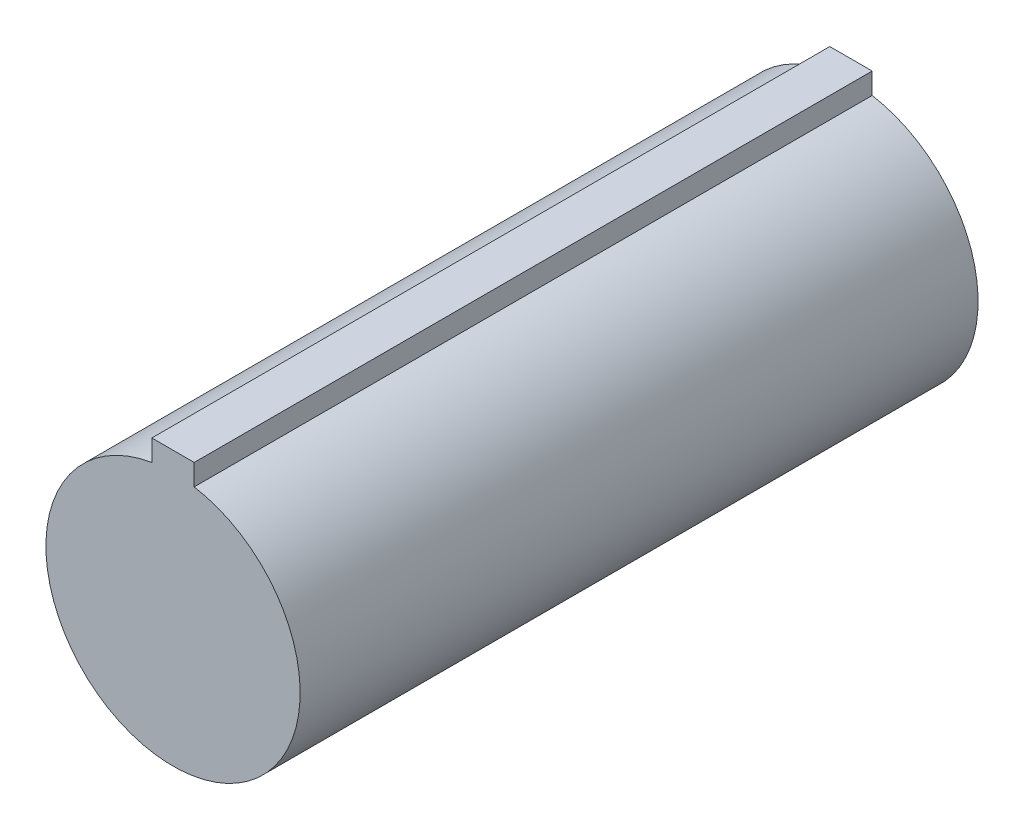
ISO-10303-21;
HEADER;
FILE_DESCRIPTION(('STEP AP214'),'2;1');
FILE_NAME('part.step','',(''),(''),'','','');
FILE_SCHEMA(('AUTOMOTIVE_DESIGN { 1 0 10303 214 1 1 1 1 }'));
ENDSEC;
DATA;
#1=APPLICATION_CONTEXT('core data for automotive mechanical design processes');
#2=APPLICATION_PROTOCOL_DEFINITION('international standard','automotive_design',2000,#1);
#3=PRODUCT_CONTEXT('',#1,'mechanical');
#4=PRODUCT('Part','Part','',(#3));
#5=PRODUCT_RELATED_PRODUCT_CATEGORY('part','',(#4));
#6=PRODUCT_DEFINITION_FORMATION('','',#4);
#7=PRODUCT_DEFINITION_CONTEXT('part definition',#1,'design');
#8=PRODUCT_DEFINITION('design','',#6,#7);
#9=PRODUCT_DEFINITION_SHAPE('','',#8);
#10=(LENGTH_UNIT() NAMED_UNIT(*) SI_UNIT(.MILLI.,.METRE.));
#11=(NAMED_UNIT(*) PLANE_ANGLE_UNIT() SI_UNIT($,.RADIAN.));
#12=(NAMED_UNIT(*) SI_UNIT($,.STERADIAN.) SOLID_ANGLE_UNIT());
#13=UNCERTAINTY_MEASURE_WITH_UNIT(LENGTH_MEASURE(1.E-05),#10,'distance_accuracy_value','');
#14=(GEOMETRIC_REPRESENTATION_CONTEXT(3) GLOBAL_UNCERTAINTY_ASSIGNED_CONTEXT((#13)) GLOBAL_UNIT_ASSIGNED_CONTEXT((#10,
#11,#12)) REPRESENTATION_CONTEXT('',''));
#15=CARTESIAN_POINT('',(0.,0.,0.));
#16=DIRECTION('',(0.,0.,1.));
#17=DIRECTION('',(1.,0.,0.));
#18=AXIS2_PLACEMENT_3D('',#15,#16,#17);
#19=CARTESIAN_POINT('',(-1.63993021072102,2.21636918130267,25.4));
#20=DIRECTION('',(0.,0.,-1.));
#21=DIRECTION('',(-1.,0.,0.));
#22=AXIS2_PLACEMENT_3D('',#19,#20,#21);
#23=CYLINDRICAL_SURFACE('',#22,4.7625);
#24=CARTESIAN_POINT('',(-1.63993021072102,2.21636918130267,0.));
#25=DIRECTION('',(0.,0.,1.));
#26=DIRECTION('',(1.,0.,0.));
#27=AXIS2_PLACEMENT_3D('',#24,#25,#26);
#28=CIRCLE('',#27,4.7625);
#29=CARTESIAN_POINT('',(-2.4321798795243,6.91251086488517,0.));
#30=VERTEX_POINT('',#29);
#31=CARTESIAN_POINT('',(-0.84768054191775,6.91251086488517,0.));
#32=VERTEX_POINT('',#31);
#33=EDGE_CURVE('E124',#30,#32,#28,.T.);
#34=ORIENTED_EDGE('',*,*,#33,.T.);
#35=DIRECTION('',(0.,0.,-1.));
#36=VECTOR('',#35,1.);
#37=CARTESIAN_POINT('',(-0.84768054191775,6.91251086488517,25.4));
#38=LINE('',#37,#36);
#39=CARTESIAN_POINT('',(-0.84768054191775,6.91251086488517,25.4));
#40=VERTEX_POINT('',#39);
#41=EDGE_CURVE('E46',#40,#32,#38,.T.);
#42=ORIENTED_EDGE('',*,*,#41,.F.);
#43=CARTESIAN_POINT('',(-1.63993021072102,2.21636918130267,25.4));
#44=DIRECTION('',(0.,0.,1.));
#45=DIRECTION('',(1.,0.,0.));
#46=AXIS2_PLACEMENT_3D('',#43,#44,#45);
#47=CIRCLE('',#46,4.7625);
#48=CARTESIAN_POINT('',(-2.4321798795243,6.91251086488517,25.4));
#49=VERTEX_POINT('',#48);
#50=EDGE_CURVE('E126',#49,#40,#47,.T.);
#51=ORIENTED_EDGE('',*,*,#50,.F.);
#52=DIRECTION('',(0.,0.,-1.));
#53=VECTOR('',#52,1.);
#54=CARTESIAN_POINT('',(-2.4321798795243,6.91251086488517,25.4));
#55=LINE('',#54,#53);
#56=EDGE_CURVE('E11',#49,#30,#55,.T.);
#57=ORIENTED_EDGE('',*,*,#56,.T.);
#58=EDGE_LOOP('',(#34,#42,#51,#57));
#59=FACE_BOUND('',#58,.T.);
#60=ADVANCED_FACE('F36',(#59),#23,.T.);
#61=CARTESIAN_POINT('',(0.,0.,25.4));
#62=DIRECTION('',(0.,0.,1.));
#63=DIRECTION('',(1.,0.,0.));
#64=AXIS2_PLACEMENT_3D('',#61,#62,#63);
#65=PLANE('',#64);
#66=ORIENTED_EDGE('',*,*,#50,.T.);
#67=DIRECTION('',(-1.,0.,0.));
#68=VECTOR('',#67,1.);
#69=CARTESIAN_POINT('',(-0.846180210721024,6.91251086488517,25.4));
#70=LINE('',#69,#68);
#71=CARTESIAN_POINT('',(-0.846180210721024,6.91251086488517,25.4));
#72=VERTEX_POINT('',#71);
#73=EDGE_CURVE('E135',#72,#40,#70,.T.);
#74=ORIENTED_EDGE('',*,*,#73,.F.);
#75=DIRECTION('',(0.,-1.,0.));
#76=VECTOR('',#75,1.);
#77=CARTESIAN_POINT('',(-0.846180210721024,7.70626086488517,25.4));
#78=LINE('',#77,#76);
#79=CARTESIAN_POINT('',(-0.846180210721024,7.70626086488517,25.4));
#80=VERTEX_POINT('',#79);
#81=EDGE_CURVE('E98',#80,#72,#78,.T.);
#82=ORIENTED_EDGE('',*,*,#81,.F.);
#83=DIRECTION('',(-1.,0.,0.));
#84=VECTOR('',#83,1.);
#85=CARTESIAN_POINT('',(-0.846180210721024,7.70626086488517,25.4));
#86=LINE('',#85,#84);
#87=CARTESIAN_POINT('',(-2.43368021072102,7.70626086488517,25.4));
#88=VERTEX_POINT('',#87);
#89=EDGE_CURVE('E96',#80,#88,#86,.T.);
#90=ORIENTED_EDGE('',*,*,#89,.T.);
#91=DIRECTION('',(0.,-1.,0.));
#92=VECTOR('',#91,1.);
#93=CARTESIAN_POINT('',(-2.43368021072102,7.70626086488517,25.4));
#94=LINE('',#93,#92);
#95=CARTESIAN_POINT('',(-2.43368021072102,6.91251086488517,25.4));
#96=VERTEX_POINT('',#95);
#97=EDGE_CURVE('E113',#88,#96,#94,.T.);
#98=ORIENTED_EDGE('',*,*,#97,.T.);
#99=EDGE_CURVE('E134',#49,#96,#70,.T.);
#100=ORIENTED_EDGE('',*,*,#99,.F.);
#101=EDGE_LOOP('',(#66,#74,#82,#90,#98,#100));
#102=FACE_BOUND('',#101,.T.);
#103=ADVANCED_FACE('F140',(#102),#65,.T.);
#104=CARTESIAN_POINT('',(0.,0.,0.));
#105=DIRECTION('',(0.,0.,1.));
#106=DIRECTION('',(1.,0.,0.));
#107=AXIS2_PLACEMENT_3D('',#104,#105,#106);
#108=PLANE('',#107);
#109=ORIENTED_EDGE('',*,*,#33,.F.);
#110=DIRECTION('',(-1.,0.,0.));
#111=VECTOR('',#110,1.);
#112=CARTESIAN_POINT('',(-0.846180210721024,6.91251086488517,0.));
#113=LINE('',#112,#111);
#114=CARTESIAN_POINT('',(-2.43368021072102,6.91251086488517,0.));
#115=VERTEX_POINT('',#114);
#116=EDGE_CURVE('E115',#30,#115,#113,.T.);
#117=ORIENTED_EDGE('',*,*,#116,.T.);
#118=DIRECTION('',(0.,-1.,0.));
#119=VECTOR('',#118,1.);
#120=CARTESIAN_POINT('',(-2.43368021072102,7.70626086488517,0.));
#121=LINE('',#120,#119);
#122=CARTESIAN_POINT('',(-2.43368021072102,7.70626086488517,0.));
#123=VERTEX_POINT('',#122);
#124=EDGE_CURVE('E107',#123,#115,#121,.T.);
#125=ORIENTED_EDGE('',*,*,#124,.F.);
#126=DIRECTION('',(-1.,0.,0.));
#127=VECTOR('',#126,1.);
#128=CARTESIAN_POINT('',(-0.846180210721024,7.70626086488517,0.));
#129=LINE('',#128,#127);
#130=CARTESIAN_POINT('',(-0.846180210721024,7.70626086488517,0.));
#131=VERTEX_POINT('',#130);
#132=EDGE_CURVE('E94',#131,#123,#129,.T.);
#133=ORIENTED_EDGE('',*,*,#132,.F.);
#134=DIRECTION('',(0.,-1.,0.));
#135=VECTOR('',#134,1.);
#136=CARTESIAN_POINT('',(-0.846180210721024,7.70626086488517,0.));
#137=LINE('',#136,#135);
#138=CARTESIAN_POINT('',(-0.846180210721024,6.91251086488517,0.));
#139=VERTEX_POINT('',#138);
#140=EDGE_CURVE('E105',#131,#139,#137,.T.);
#141=ORIENTED_EDGE('',*,*,#140,.T.);
#142=EDGE_CURVE('E111',#139,#32,#113,.T.);
#143=ORIENTED_EDGE('',*,*,#142,.T.);
#144=EDGE_LOOP('',(#109,#117,#125,#133,#141,#143));
#145=FACE_BOUND('',#144,.T.);
#146=ADVANCED_FACE('F103',(#145),#108,.F.);
#147=CARTESIAN_POINT('',(-2.43368021072102,7.70626086488517,25.4));
#148=DIRECTION('',(1.,0.,0.));
#149=DIRECTION('',(0.,0.,-1.));
#150=AXIS2_PLACEMENT_3D('',#147,#148,#149);
#151=PLANE('',#150);
#152=ORIENTED_EDGE('',*,*,#124,.T.);
#153=DIRECTION('',(0.,0.,-1.));
#154=VECTOR('',#153,1.);
#155=CARTESIAN_POINT('',(-2.43368021072102,6.91251086488517,25.4));
#156=LINE('',#155,#154);
#157=EDGE_CURVE('E119',#96,#115,#156,.T.);
#158=ORIENTED_EDGE('',*,*,#157,.F.);
#159=ORIENTED_EDGE('',*,*,#97,.F.);
#160=DIRECTION('',(0.,0.,-1.));
#161=VECTOR('',#160,1.);
#162=CARTESIAN_POINT('',(-2.43368021072102,7.70626086488517,25.4));
#163=LINE('',#162,#161);
#164=EDGE_CURVE('E40',#88,#123,#163,.T.);
#165=ORIENTED_EDGE('',*,*,#164,.T.);
#166=EDGE_LOOP('',(#152,#158,#159,#165));
#167=FACE_BOUND('',#166,.T.);
#168=ADVANCED_FACE('F152',(#167),#151,.F.);
#169=CARTESIAN_POINT('',(-0.846180210721024,6.91251086488517,25.4));
#170=DIRECTION('',(0.,-1.,0.));
#171=DIRECTION('',(0.,0.,-1.));
#172=AXIS2_PLACEMENT_3D('',#169,#170,#171);
#173=PLANE('',#172);
#174=ORIENTED_EDGE('',*,*,#56,.F.);
#175=ORIENTED_EDGE('',*,*,#99,.T.);
#176=ORIENTED_EDGE('',*,*,#157,.T.);
#177=ORIENTED_EDGE('',*,*,#116,.F.);
#178=EDGE_LOOP('',(#174,#175,#176,#177));
#179=FACE_BOUND('',#178,.T.);
#180=ADVANCED_FACE('F137',(#179),#173,.T.);
#181=ORIENTED_EDGE('',*,*,#41,.T.);
#182=ORIENTED_EDGE('',*,*,#142,.F.);
#183=DIRECTION('',(0.,0.,-1.));
#184=VECTOR('',#183,1.);
#185=CARTESIAN_POINT('',(-0.846180210721024,6.91251086488517,25.4));
#186=LINE('',#185,#184);
#187=EDGE_CURVE('E85',#72,#139,#186,.T.);
#188=ORIENTED_EDGE('',*,*,#187,.F.);
#189=ORIENTED_EDGE('',*,*,#73,.T.);
#190=EDGE_LOOP('',(#181,#182,#188,#189));
#191=FACE_BOUND('',#190,.T.);
#192=ADVANCED_FACE('F151',(#191),#173,.T.);
#193=CARTESIAN_POINT('',(-0.846180210721024,7.70626086488517,25.4));
#194=DIRECTION('',(1.,0.,0.));
#195=DIRECTION('',(0.,0.,-1.));
#196=AXIS2_PLACEMENT_3D('',#193,#194,#195);
#197=PLANE('',#196);
#198=ORIENTED_EDGE('',*,*,#140,.F.);
#199=DIRECTION('',(0.,0.,-1.));
#200=VECTOR('',#199,1.);
#201=CARTESIAN_POINT('',(-0.846180210721024,7.70626086488517,25.4));
#202=LINE('',#201,#200);
#203=EDGE_CURVE('E91',#80,#131,#202,.T.);
#204=ORIENTED_EDGE('',*,*,#203,.F.);
#205=ORIENTED_EDGE('',*,*,#81,.T.);
#206=ORIENTED_EDGE('',*,*,#187,.T.);
#207=EDGE_LOOP('',(#198,#204,#205,#206));
#208=FACE_BOUND('',#207,.T.);
#209=ADVANCED_FACE('F110',(#208),#197,.T.);
#210=CARTESIAN_POINT('',(-0.846180210721024,7.70626086488517,25.4));
#211=DIRECTION('',(0.,-1.,0.));
#212=DIRECTION('',(0.,0.,-1.));
#213=AXIS2_PLACEMENT_3D('',#210,#211,#212);
#214=PLANE('',#213);
#215=ORIENTED_EDGE('',*,*,#132,.T.);
#216=ORIENTED_EDGE('',*,*,#164,.F.);
#217=ORIENTED_EDGE('',*,*,#89,.F.);
#218=ORIENTED_EDGE('',*,*,#203,.T.);
#219=EDGE_LOOP('',(#215,#216,#217,#218));
#220=FACE_BOUND('',#219,.T.);
#221=ADVANCED_FACE('F38',(#220),#214,.F.);
#222=CLOSED_SHELL('',(#60,#103,#146,#168,#180,#192,#209,#221));
#223=MANIFOLD_SOLID_BREP('B2',#222);
#224=ADVANCED_BREP_SHAPE_REPRESENTATION('',(#18,#223),#14);
#225=SHAPE_DEFINITION_REPRESENTATION(#9,#224);
ENDSEC;
END-ISO-10303-21;
